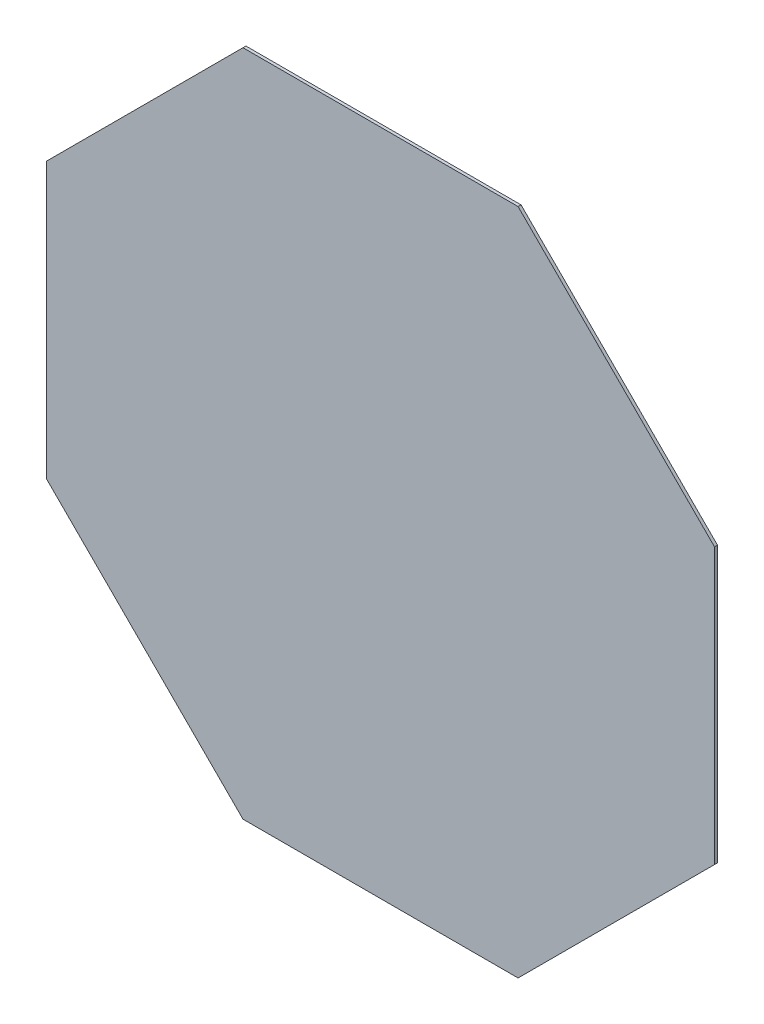
ISO-10303-21;
HEADER;
FILE_DESCRIPTION(('STEP AP214'),'2;1');
FILE_NAME('part.step','',(''),(''),'','','');
FILE_SCHEMA(('AUTOMOTIVE_DESIGN { 1 0 10303 214 1 1 1 1 }'));
ENDSEC;
DATA;
#1=APPLICATION_CONTEXT('core data for automotive mechanical design processes');
#2=APPLICATION_PROTOCOL_DEFINITION('international standard','automotive_design',2000,#1);
#3=PRODUCT_CONTEXT('',#1,'mechanical');
#4=PRODUCT('Part','Part','',(#3));
#5=PRODUCT_RELATED_PRODUCT_CATEGORY('part','',(#4));
#6=PRODUCT_DEFINITION_FORMATION('','',#4);
#7=PRODUCT_DEFINITION_CONTEXT('part definition',#1,'design');
#8=PRODUCT_DEFINITION('design','',#6,#7);
#9=PRODUCT_DEFINITION_SHAPE('','',#8);
#10=(LENGTH_UNIT() NAMED_UNIT(*) SI_UNIT(.MILLI.,.METRE.));
#11=(NAMED_UNIT(*) PLANE_ANGLE_UNIT() SI_UNIT($,.RADIAN.));
#12=(NAMED_UNIT(*) SI_UNIT($,.STERADIAN.) SOLID_ANGLE_UNIT());
#13=UNCERTAINTY_MEASURE_WITH_UNIT(LENGTH_MEASURE(1.E-05),#10,'distance_accuracy_value','');
#14=(GEOMETRIC_REPRESENTATION_CONTEXT(3) GLOBAL_UNCERTAINTY_ASSIGNED_CONTEXT((#13)) GLOBAL_UNIT_ASSIGNED_CONTEXT((#10,
#11,#12)) REPRESENTATION_CONTEXT('',''));
#15=CARTESIAN_POINT('',(0.,0.,0.));
#16=DIRECTION('',(0.,0.,1.));
#17=DIRECTION('',(1.,0.,0.));
#18=AXIS2_PLACEMENT_3D('',#15,#16,#17);
#19=CARTESIAN_POINT('',(680.,0.,3.));
#20=DIRECTION('',(0.,1.,0.));
#21=DIRECTION('',(0.,0.,1.));
#22=AXIS2_PLACEMENT_3D('',#19,#20,#21);
#23=PLANE('',#22);
#24=DIRECTION('',(1.,0.,0.));
#25=VECTOR('',#24,1.);
#26=CARTESIAN_POINT('',(680.,0.,3.));
#27=LINE('',#26,#25);
#28=CARTESIAN_POINT('',(200.,0.,3.));
#29=VERTEX_POINT('',#28);
#30=CARTESIAN_POINT('',(479.999999999999,0.,3.));
#31=VERTEX_POINT('',#30);
#32=EDGE_CURVE('E132',#29,#31,#27,.T.);
#33=ORIENTED_EDGE('',*,*,#32,.F.);
#34=DIRECTION('',(0.,0.,-1.));
#35=VECTOR('',#34,1.);
#36=CARTESIAN_POINT('',(200.,0.,3.));
#37=LINE('',#36,#35);
#38=CARTESIAN_POINT('',(200.,0.,0.));
#39=VERTEX_POINT('',#38);
#40=EDGE_CURVE('E116',#29,#39,#37,.T.);
#41=ORIENTED_EDGE('',*,*,#40,.T.);
#42=DIRECTION('',(1.,0.,0.));
#43=VECTOR('',#42,1.);
#44=CARTESIAN_POINT('',(680.,0.,0.));
#45=LINE('',#44,#43);
#46=CARTESIAN_POINT('',(479.999999999999,0.,0.));
#47=VERTEX_POINT('',#46);
#48=EDGE_CURVE('E129',#39,#47,#45,.T.);
#49=ORIENTED_EDGE('',*,*,#48,.T.);
#50=DIRECTION('',(0.,0.,1.));
#51=VECTOR('',#50,1.);
#52=CARTESIAN_POINT('',(479.999999999999,0.,3.));
#53=LINE('',#52,#51);
#54=EDGE_CURVE('E135',#47,#31,#53,.T.);
#55=ORIENTED_EDGE('',*,*,#54,.T.);
#56=EDGE_LOOP('',(#33,#41,#49,#55));
#57=FACE_BOUND('',#56,.T.);
#58=ADVANCED_FACE('F45',(#57),#23,.F.);
#59=CARTESIAN_POINT('',(680.,680.,3.));
#60=DIRECTION('',(-1.,0.,0.));
#61=DIRECTION('',(0.,-1.,0.));
#62=AXIS2_PLACEMENT_3D('',#59,#60,#61);
#63=PLANE('',#62);
#64=DIRECTION('',(0.,1.,0.));
#65=VECTOR('',#64,1.);
#66=CARTESIAN_POINT('',(680.,680.,3.));
#67=LINE('',#66,#65);
#68=CARTESIAN_POINT('',(680.,200.,3.));
#69=VERTEX_POINT('',#68);
#70=CARTESIAN_POINT('',(680.,479.999999999999,3.));
#71=VERTEX_POINT('',#70);
#72=EDGE_CURVE('E203',#69,#71,#67,.T.);
#73=ORIENTED_EDGE('',*,*,#72,.F.);
#74=DIRECTION('',(0.,0.,-1.));
#75=VECTOR('',#74,1.);
#76=CARTESIAN_POINT('',(680.,200.,3.));
#77=LINE('',#76,#75);
#78=CARTESIAN_POINT('',(680.,200.,0.));
#79=VERTEX_POINT('',#78);
#80=EDGE_CURVE('E183',#69,#79,#77,.T.);
#81=ORIENTED_EDGE('',*,*,#80,.T.);
#82=DIRECTION('',(0.,1.,0.));
#83=VECTOR('',#82,1.);
#84=CARTESIAN_POINT('',(680.,680.,0.));
#85=LINE('',#84,#83);
#86=CARTESIAN_POINT('',(680.,479.999999999999,0.));
#87=VERTEX_POINT('',#86);
#88=EDGE_CURVE('E140',#79,#87,#85,.T.);
#89=ORIENTED_EDGE('',*,*,#88,.T.);
#90=DIRECTION('',(0.,0.,1.));
#91=VECTOR('',#90,1.);
#92=CARTESIAN_POINT('',(680.,479.999999999999,3.));
#93=LINE('',#92,#91);
#94=EDGE_CURVE('E180',#87,#71,#93,.T.);
#95=ORIENTED_EDGE('',*,*,#94,.T.);
#96=EDGE_LOOP('',(#73,#81,#89,#95));
#97=FACE_BOUND('',#96,.T.);
#98=ADVANCED_FACE('F215',(#97),#63,.F.);
#99=CARTESIAN_POINT('',(0.,680.,3.));
#100=DIRECTION('',(0.,-1.,0.));
#101=DIRECTION('',(0.,0.,-1.));
#102=AXIS2_PLACEMENT_3D('',#99,#100,#101);
#103=PLANE('',#102);
#104=DIRECTION('',(-1.,0.,0.));
#105=VECTOR('',#104,1.);
#106=CARTESIAN_POINT('',(0.,680.,0.));
#107=LINE('',#106,#105);
#108=CARTESIAN_POINT('',(480.,680.,0.));
#109=VERTEX_POINT('',#108);
#110=CARTESIAN_POINT('',(200.000000000001,680.,0.));
#111=VERTEX_POINT('',#110);
#112=EDGE_CURVE('E144',#109,#111,#107,.T.);
#113=ORIENTED_EDGE('',*,*,#112,.T.);
#114=DIRECTION('',(0.,0.,1.));
#115=VECTOR('',#114,1.);
#116=CARTESIAN_POINT('',(200.000000000001,680.,3.));
#117=LINE('',#116,#115);
#118=CARTESIAN_POINT('',(200.000000000001,680.,3.));
#119=VERTEX_POINT('',#118);
#120=EDGE_CURVE('E11',#111,#119,#117,.T.);
#121=ORIENTED_EDGE('',*,*,#120,.T.);
#122=DIRECTION('',(-1.,0.,0.));
#123=VECTOR('',#122,1.);
#124=CARTESIAN_POINT('',(0.,680.,3.));
#125=LINE('',#124,#123);
#126=CARTESIAN_POINT('',(480.,680.,3.));
#127=VERTEX_POINT('',#126);
#128=EDGE_CURVE('E191',#127,#119,#125,.T.);
#129=ORIENTED_EDGE('',*,*,#128,.F.);
#130=DIRECTION('',(0.,0.,-1.));
#131=VECTOR('',#130,1.);
#132=CARTESIAN_POINT('',(480.,680.,3.));
#133=LINE('',#132,#131);
#134=EDGE_CURVE('E55',#127,#109,#133,.T.);
#135=ORIENTED_EDGE('',*,*,#134,.T.);
#136=EDGE_LOOP('',(#113,#121,#129,#135));
#137=FACE_BOUND('',#136,.T.);
#138=ADVANCED_FACE('F190',(#137),#103,.F.);
#139=CARTESIAN_POINT('',(0.,0.,3.));
#140=DIRECTION('',(1.,0.,0.));
#141=DIRECTION('',(0.,0.,-1.));
#142=AXIS2_PLACEMENT_3D('',#139,#140,#141);
#143=PLANE('',#142);
#144=DIRECTION('',(0.,-1.,0.));
#145=VECTOR('',#144,1.);
#146=CARTESIAN_POINT('',(0.,0.,0.));
#147=LINE('',#146,#145);
#148=CARTESIAN_POINT('',(0.,480.,0.));
#149=VERTEX_POINT('',#148);
#150=CARTESIAN_POINT('',(0.,200.000000000001,0.));
#151=VERTEX_POINT('',#150);
#152=EDGE_CURVE('E152',#149,#151,#147,.T.);
#153=ORIENTED_EDGE('',*,*,#152,.T.);
#154=DIRECTION('',(0.,0.,1.));
#155=VECTOR('',#154,1.);
#156=CARTESIAN_POINT('',(0.,200.000000000001,3.));
#157=LINE('',#156,#155);
#158=CARTESIAN_POINT('',(0.,200.000000000001,3.));
#159=VERTEX_POINT('',#158);
#160=EDGE_CURVE('E117',#151,#159,#157,.T.);
#161=ORIENTED_EDGE('',*,*,#160,.T.);
#162=DIRECTION('',(0.,-1.,0.));
#163=VECTOR('',#162,1.);
#164=CARTESIAN_POINT('',(0.,0.,3.));
#165=LINE('',#164,#163);
#166=CARTESIAN_POINT('',(0.,480.,3.));
#167=VERTEX_POINT('',#166);
#168=EDGE_CURVE('E147',#167,#159,#165,.T.);
#169=ORIENTED_EDGE('',*,*,#168,.F.);
#170=DIRECTION('',(0.,0.,-1.));
#171=VECTOR('',#170,1.);
#172=CARTESIAN_POINT('',(0.,480.,3.));
#173=LINE('',#172,#171);
#174=EDGE_CURVE('E123',#167,#149,#173,.T.);
#175=ORIENTED_EDGE('',*,*,#174,.T.);
#176=EDGE_LOOP('',(#153,#161,#169,#175));
#177=FACE_BOUND('',#176,.T.);
#178=ADVANCED_FACE('F199',(#177),#143,.F.);
#179=CARTESIAN_POINT('',(0.,0.,3.));
#180=DIRECTION('',(0.,0.,-1.));
#181=DIRECTION('',(-1.,0.,0.));
#182=AXIS2_PLACEMENT_3D('',#179,#180,#181);
#183=PLANE('',#182);
#184=ORIENTED_EDGE('',*,*,#168,.T.);
#185=DIRECTION('',(-0.707106781186546,0.707106781186549,0.));
#186=VECTOR('',#185,1.);
#187=CARTESIAN_POINT('',(200.,0.,3.));
#188=LINE('',#187,#186);
#189=EDGE_CURVE('E177',#159,#29,#188,.F.);
#190=ORIENTED_EDGE('',*,*,#189,.T.);
#191=ORIENTED_EDGE('',*,*,#32,.T.);
#192=DIRECTION('',(-0.707106781186549,-0.707106781186546,0.));
#193=VECTOR('',#192,1.);
#194=CARTESIAN_POINT('',(680.,200.,3.));
#195=LINE('',#194,#193);
#196=EDGE_CURVE('E174',#31,#69,#195,.F.);
#197=ORIENTED_EDGE('',*,*,#196,.T.);
#198=ORIENTED_EDGE('',*,*,#72,.T.);
#199=DIRECTION('',(0.707106781186546,-0.707106781186549,0.));
#200=VECTOR('',#199,1.);
#201=CARTESIAN_POINT('',(480.,680.,3.));
#202=LINE('',#201,#200);
#203=EDGE_CURVE('E67',#71,#127,#202,.F.);
#204=ORIENTED_EDGE('',*,*,#203,.T.);
#205=ORIENTED_EDGE('',*,*,#128,.T.);
#206=DIRECTION('',(0.707106781186549,0.707106781186546,0.));
#207=VECTOR('',#206,1.);
#208=CARTESIAN_POINT('',(0.,480.,3.));
#209=LINE('',#208,#207);
#210=EDGE_CURVE('E171',#119,#167,#209,.F.);
#211=ORIENTED_EDGE('',*,*,#210,.T.);
#212=EDGE_LOOP('',(#184,#190,#191,#197,#198,#204,#205,#211));
#213=FACE_BOUND('',#212,.T.);
#214=ADVANCED_FACE('F209',(#213),#183,.F.);
#215=CARTESIAN_POINT('',(0.,0.,0.));
#216=DIRECTION('',(0.,0.,-1.));
#217=DIRECTION('',(-1.,0.,0.));
#218=AXIS2_PLACEMENT_3D('',#215,#216,#217);
#219=PLANE('',#218);
#220=ORIENTED_EDGE('',*,*,#48,.F.);
#221=DIRECTION('',(0.707106781186546,-0.707106781186549,0.));
#222=VECTOR('',#221,1.);
#223=CARTESIAN_POINT('',(100.,100.,0.));
#224=LINE('',#223,#222);
#225=EDGE_CURVE('E112',#39,#151,#224,.F.);
#226=ORIENTED_EDGE('',*,*,#225,.T.);
#227=ORIENTED_EDGE('',*,*,#152,.F.);
#228=DIRECTION('',(-0.707106781186549,-0.707106781186546,0.));
#229=VECTOR('',#228,1.);
#230=CARTESIAN_POINT('',(-240.,240.000000000001,0.));
#231=LINE('',#230,#229);
#232=EDGE_CURVE('E159',#149,#111,#231,.F.);
#233=ORIENTED_EDGE('',*,*,#232,.T.);
#234=ORIENTED_EDGE('',*,*,#112,.F.);
#235=DIRECTION('',(-0.707106781186546,0.707106781186549,0.));
#236=VECTOR('',#235,1.);
#237=CARTESIAN_POINT('',(580.000000000001,579.999999999999,0.));
#238=LINE('',#237,#236);
#239=EDGE_CURVE('E134',#109,#87,#238,.F.);
#240=ORIENTED_EDGE('',*,*,#239,.T.);
#241=ORIENTED_EDGE('',*,*,#88,.F.);
#242=DIRECTION('',(0.707106781186549,0.707106781186546,0.));
#243=VECTOR('',#242,1.);
#244=CARTESIAN_POINT('',(239.999999999999,-240.,0.));
#245=LINE('',#244,#243);
#246=EDGE_CURVE('E124',#79,#47,#245,.F.);
#247=ORIENTED_EDGE('',*,*,#246,.T.);
#248=EDGE_LOOP('',(#220,#226,#227,#233,#234,#240,#241,#247));
#249=FACE_BOUND('',#248,.T.);
#250=ADVANCED_FACE('F137',(#249),#219,.T.);
#251=CARTESIAN_POINT('',(200.,0.,3.));
#252=DIRECTION('',(0.707106781186549,0.707106781186546,0.));
#253=DIRECTION('',(0.,0.,-1.));
#254=AXIS2_PLACEMENT_3D('',#251,#252,#253);
#255=PLANE('',#254);
#256=ORIENTED_EDGE('',*,*,#189,.F.);
#257=ORIENTED_EDGE('',*,*,#160,.F.);
#258=ORIENTED_EDGE('',*,*,#225,.F.);
#259=ORIENTED_EDGE('',*,*,#40,.F.);
#260=EDGE_LOOP('',(#256,#257,#258,#259));
#261=FACE_BOUND('',#260,.T.);
#262=ADVANCED_FACE('F115',(#261),#255,.F.);
#263=CARTESIAN_POINT('',(680.,200.,3.));
#264=DIRECTION('',(-0.707106781186546,0.707106781186549,0.));
#265=DIRECTION('',(0.,0.,-1.));
#266=AXIS2_PLACEMENT_3D('',#263,#264,#265);
#267=PLANE('',#266);
#268=ORIENTED_EDGE('',*,*,#196,.F.);
#269=ORIENTED_EDGE('',*,*,#54,.F.);
#270=ORIENTED_EDGE('',*,*,#246,.F.);
#271=ORIENTED_EDGE('',*,*,#80,.F.);
#272=EDGE_LOOP('',(#268,#269,#270,#271));
#273=FACE_BOUND('',#272,.T.);
#274=ADVANCED_FACE('F213',(#273),#267,.F.);
#275=CARTESIAN_POINT('',(0.,480.,3.));
#276=DIRECTION('',(0.707106781186546,-0.707106781186549,0.));
#277=DIRECTION('',(0.,0.,-1.));
#278=AXIS2_PLACEMENT_3D('',#275,#276,#277);
#279=PLANE('',#278);
#280=ORIENTED_EDGE('',*,*,#210,.F.);
#281=ORIENTED_EDGE('',*,*,#120,.F.);
#282=ORIENTED_EDGE('',*,*,#232,.F.);
#283=ORIENTED_EDGE('',*,*,#174,.F.);
#284=EDGE_LOOP('',(#280,#281,#282,#283));
#285=FACE_BOUND('',#284,.T.);
#286=ADVANCED_FACE('F196',(#285),#279,.F.);
#287=CARTESIAN_POINT('',(480.,680.,3.));
#288=DIRECTION('',(-0.707106781186549,-0.707106781186546,0.));
#289=DIRECTION('',(0.,0.,-1.));
#290=AXIS2_PLACEMENT_3D('',#287,#288,#289);
#291=PLANE('',#290);
#292=ORIENTED_EDGE('',*,*,#203,.F.);
#293=ORIENTED_EDGE('',*,*,#94,.F.);
#294=ORIENTED_EDGE('',*,*,#239,.F.);
#295=ORIENTED_EDGE('',*,*,#134,.F.);
#296=EDGE_LOOP('',(#292,#293,#294,#295));
#297=FACE_BOUND('',#296,.T.);
#298=ADVANCED_FACE('F48',(#297),#291,.F.);
#299=CLOSED_SHELL('',(#58,#98,#138,#178,#214,#250,#262,#274,#286,#298));
#300=MANIFOLD_SOLID_BREP('B2',#299);
#301=ADVANCED_BREP_SHAPE_REPRESENTATION('',(#18,#300),#14);
#302=SHAPE_DEFINITION_REPRESENTATION(#9,#301);
ENDSEC;
END-ISO-10303-21;
